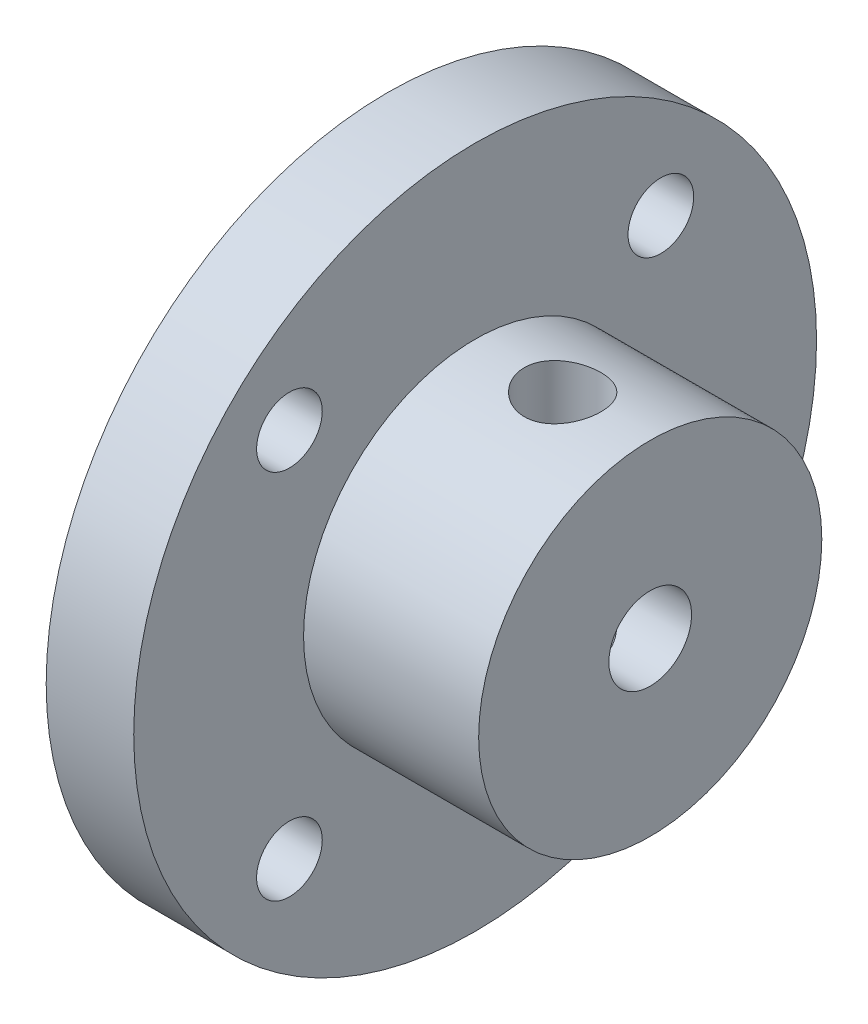
ISO-10303-21;
HEADER;
FILE_DESCRIPTION(('STEP AP214'),'2;1');
FILE_NAME('part.step','',(''),(''),'','','');
FILE_SCHEMA(('AUTOMOTIVE_DESIGN { 1 0 10303 214 1 1 1 1 }'));
ENDSEC;
DATA;
#1=APPLICATION_CONTEXT('core data for automotive mechanical design processes');
#2=APPLICATION_PROTOCOL_DEFINITION('international standard','automotive_design',2000,#1);
#3=PRODUCT_CONTEXT('',#1,'mechanical');
#4=PRODUCT('Part','Part','',(#3));
#5=PRODUCT_RELATED_PRODUCT_CATEGORY('part','',(#4));
#6=PRODUCT_DEFINITION_FORMATION('','',#4);
#7=PRODUCT_DEFINITION_CONTEXT('part definition',#1,'design');
#8=PRODUCT_DEFINITION('design','',#6,#7);
#9=PRODUCT_DEFINITION_SHAPE('','',#8);
#10=(LENGTH_UNIT() NAMED_UNIT(*) SI_UNIT(.MILLI.,.METRE.));
#11=(NAMED_UNIT(*) PLANE_ANGLE_UNIT() SI_UNIT($,.RADIAN.));
#12=(NAMED_UNIT(*) SI_UNIT($,.STERADIAN.) SOLID_ANGLE_UNIT());
#13=UNCERTAINTY_MEASURE_WITH_UNIT(LENGTH_MEASURE(1.E-05),#10,'distance_accuracy_value','');
#14=(GEOMETRIC_REPRESENTATION_CONTEXT(3) GLOBAL_UNCERTAINTY_ASSIGNED_CONTEXT((#13)) GLOBAL_UNIT_ASSIGNED_CONTEXT((#10,
#11,#12)) REPRESENTATION_CONTEXT('',''));
#15=CARTESIAN_POINT('',(0.,0.,0.));
#16=DIRECTION('',(0.,0.,1.));
#17=DIRECTION('',(1.,0.,0.));
#18=AXIS2_PLACEMENT_3D('',#15,#16,#17);
#19=CARTESIAN_POINT('',(33.655,6.25695273145224,0.));
#20=DIRECTION('',(0.,-1.,0.));
#21=DIRECTION('',(0.,0.,-1.));
#22=AXIS2_PLACEMENT_3D('',#19,#20,#21);
#23=CYLINDRICAL_SURFACE('',#22,1.3890625);
#24=CARTESIAN_POINT('',(33.6550000018551,0.566131930488629,-1.38906250011282));
#25=CARTESIAN_POINT('',(33.6169445172271,0.566136363436016,-1.38906135042295));
#26=CARTESIAN_POINT('',(33.578882143224,0.570073234715434,-1.38747438866743));
#27=CARTESIAN_POINT('',(33.5042424862001,0.584696733341379,-1.38137125984007));
#28=CARTESIAN_POINT('',(33.467673787758,0.595417755854354,-1.3768401630535));
#29=CARTESIAN_POINT('',(33.3779129445369,0.628256164088429,-1.36225982533473));
#30=CARTESIAN_POINT('',(33.3261559715453,0.6534020330621,-1.35055961896984));
#31=CARTESIAN_POINT('',(33.2267498564527,0.708660036600426,-1.32241381791735));
#32=CARTESIAN_POINT('',(33.1791175411902,0.738791177298636,-1.30594987449918));
#33=CARTESIAN_POINT('',(33.0898272504429,0.799328389285977,-1.26974272762883));
#34=CARTESIAN_POINT('',(33.0479824606748,0.829611786151766,-1.25025244373348));
#35=CARTESIAN_POINT('',(32.9667509994849,0.890776794559745,-1.20744222947006));
#36=CARTESIAN_POINT('',(32.9273661639242,0.921658830866459,-1.1841194849779));
#37=CARTESIAN_POINT('',(32.8127814790822,1.01377724304036,-1.10839860037947));
#38=CARTESIAN_POINT('',(32.7409454486453,1.07463650939975,-1.0501637134381));
#39=CARTESIAN_POINT('',(32.6250346984733,1.1750598373887,-0.93461893162));
#40=CARTESIAN_POINT('',(32.5785757522292,1.21607083178449,-0.88093575263937));
#41=CARTESIAN_POINT('',(32.4929806941401,1.29244486914924,-0.764466639580026));
#42=CARTESIAN_POINT('',(32.4538317546558,1.32781778955935,-0.701697000846168));
#43=CARTESIAN_POINT('',(32.3919610720956,1.38406863584518,-0.581229147722764));
#44=CARTESIAN_POINT('',(32.3675172598741,1.40643147781827,-0.52511525562623));
#45=CARTESIAN_POINT('',(32.3258147627696,1.44470386715526,-0.408173136065107));
#46=CARTESIAN_POINT('',(32.3085518685538,1.46061719497445,-0.347347695307682));
#47=CARTESIAN_POINT('',(32.282286397532,1.48486442696496,-0.221983584187299));
#48=CARTESIAN_POINT('',(32.2733411512151,1.49314572293324,-0.157422353539631));
#49=CARTESIAN_POINT('',(32.2646726987844,1.50117033703527,-0.0271617916335321));
#50=CARTESIAN_POINT('',(32.2649450487208,1.50091776948048,0.0385369759303967));
#51=CARTESIAN_POINT('',(32.2741246124243,1.49242087146897,0.161397126086323));
#52=CARTESIAN_POINT('',(32.282071569503,1.48506528658008,0.218697772902944));
#53=CARTESIAN_POINT('',(32.3046842064253,1.46418555978732,0.330774166486678));
#54=CARTESIAN_POINT('',(32.3193509055433,1.4506604820742,0.385549528821872));
#55=CARTESIAN_POINT('',(32.3552766932254,1.41765070145482,0.493538521911287));
#56=CARTESIAN_POINT('',(32.3767708622444,1.39795388796705,0.546607626094066));
#57=CARTESIAN_POINT('',(32.4251240438646,1.35388415473823,0.64812554883569));
#58=CARTESIAN_POINT('',(32.4519856818923,1.3295089468536,0.696572089126721));
#59=CARTESIAN_POINT('',(32.5254352084737,1.26334618741132,0.812688908873887));
#60=CARTESIAN_POINT('',(32.5749801323678,1.21913123616765,0.877115357278088));
#61=CARTESIAN_POINT('',(32.6820330158722,1.12538928296294,0.994574693945786));
#62=CARTESIAN_POINT('',(32.7395631791074,1.07584755916379,1.04757472290472));
#63=CARTESIAN_POINT('',(32.862755533221,0.97310190374408,1.14372797191206));
#64=CARTESIAN_POINT('',(32.9285847493599,0.91983745259234,1.1866026547405));
#65=CARTESIAN_POINT('',(33.0325634316817,0.84109300249821,1.24241881793917));
#66=CARTESIAN_POINT('',(33.0680772516681,0.815049059569115,1.25960204433672));
#67=CARTESIAN_POINT('',(33.1411256359287,0.76412026149232,1.29112809224325));
#68=CARTESIAN_POINT('',(33.1786586040067,0.739234518958341,1.30547311665778));
#69=CARTESIAN_POINT('',(33.2536415987214,0.693376581937049,1.33036234023032));
#70=CARTESIAN_POINT('',(33.2909362211174,0.672254841695213,1.34109387455841));
#71=CARTESIAN_POINT('',(33.3681382343715,0.633779428095628,1.35969757594909));
#72=CARTESIAN_POINT('',(33.4080420186164,0.616420690743516,1.36757359549622));
#73=CARTESIAN_POINT('',(33.4822943590198,0.591086061043343,1.37868479636043));
#74=CARTESIAN_POINT('',(33.5161251075231,0.58192054112127,1.38253765716265));
#75=CARTESIAN_POINT('',(33.5849722146235,0.569453283942936,1.38772194270802));
#76=CARTESIAN_POINT('',(33.6199831920039,0.566127851222921,1.38906355799989));
#77=CARTESIAN_POINT('',(33.6930554874779,0.566136363697341,1.38906135018944));
#78=CARTESIAN_POINT('',(33.7311178618527,0.570073235370381,1.38747438836632));
#79=CARTESIAN_POINT('',(33.8057575195479,0.584696734813171,1.38137125925439));
#80=CARTESIAN_POINT('',(33.8423262182885,0.59541775775255,1.37684016224877));
#81=CARTESIAN_POINT('',(33.9320870627309,0.628256167233447,1.36225982388166));
#82=CARTESIAN_POINT('',(33.9838440365631,0.653402037117517,1.35055961702672));
#83=CARTESIAN_POINT('',(34.083250153225,0.708660042431336,1.32241381482273));
#84=CARTESIAN_POINT('',(34.1308824692165,0.738791183993596,1.3059498707433));
#85=CARTESIAN_POINT('',(34.2201727606411,0.799328397135918,1.26974272269951));
#86=CARTESIAN_POINT('',(34.2620175504059,0.829611794268025,1.25025243836101));
#87=CARTESIAN_POINT('',(34.3432490115849,0.890776803120445,1.20744222316865));
#88=CARTESIAN_POINT('',(34.3826338471382,0.921658839605203,1.1841194781908));
#89=CARTESIAN_POINT('',(34.497218531913,1.01377725219562,1.10839859206694));
#90=CARTESIAN_POINT('',(34.5690545622584,1.07463651868664,1.05016370401031));
#91=CARTESIAN_POINT('',(34.6849653112555,1.17505984592962,0.934618920854931));
#92=CARTESIAN_POINT('',(34.731424256568,1.21607083957968,0.880935741841297));
#93=CARTESIAN_POINT('',(34.8170193128417,1.29244487543423,0.764466628912017));
#94=CARTESIAN_POINT('',(34.8561682514416,1.32781779507963,0.701696990340401));
#95=CARTESIAN_POINT('',(34.9180389326472,1.3840686401753,0.581229137401013));
#96=CARTESIAN_POINT('',(34.9424827443489,1.40643148168537,0.525115245251408));
#97=CARTESIAN_POINT('',(34.9841852404068,1.44470387007897,0.408173125694451));
#98=CARTESIAN_POINT('',(35.001448134096,1.46061719741787,0.347347684994239));
#99=CARTESIAN_POINT('',(35.0277136040826,1.48486442845834,0.221983574133389));
#100=CARTESIAN_POINT('',(35.0366588498928,1.49314572395863,0.157422343689642));
#101=CARTESIAN_POINT('',(35.0453273013838,1.50117033719126,0.0271617823191361));
#102=CARTESIAN_POINT('',(35.0450549510139,1.50091776923466,-0.0385369849132359));
#103=CARTESIAN_POINT('',(35.035875386581,1.49242087054839,-0.161397134558102));
#104=CARTESIAN_POINT('',(35.0279284291694,1.48506528535235,-0.218697781201054));
#105=CARTESIAN_POINT('',(35.005315791635,1.4641855579982,-0.330774174381235));
#106=CARTESIAN_POINT('',(34.9906490922379,1.45066048003078,-0.38554953648651));
#107=CARTESIAN_POINT('',(34.954723303967,1.41765069887999,-0.493538529315782));
#108=CARTESIAN_POINT('',(34.9332291346131,1.3979538850926,-0.546607633450231));
#109=CARTESIAN_POINT('',(34.8848759523397,1.35388415128909,-0.648125556044703));
#110=CARTESIAN_POINT('',(34.8580143139937,1.32950894312948,-0.696572096236926));
#111=CARTESIAN_POINT('',(34.7845647864979,1.26334618291036,-0.812688915898741));
#112=CARTESIAN_POINT('',(34.7350198619881,1.21913123115856,-0.877115364258926));
#113=CARTESIAN_POINT('',(34.627966977229,1.12538927698881,-0.994574700722774));
#114=CARTESIAN_POINT('',(34.5704368133542,1.07584755273244,-1.04757472952051));
#115=CARTESIAN_POINT('',(34.4472444578882,0.973101896482502,-1.14372797809964));
#116=CARTESIAN_POINT('',(34.3814152410345,0.919837444959954,-1.18660266065673));
#117=CARTESIAN_POINT('',(34.2774365575354,0.841092994506663,-1.24241882334943));
#118=CARTESIAN_POINT('',(34.2419227371393,0.815049051490737,-1.25960204956193));
#119=CARTESIAN_POINT('',(34.1688743520019,0.764120253355393,-1.29112809705702));
#120=CARTESIAN_POINT('',(34.1313413834572,0.739234510849511,-1.30547312124544));
#121=CARTESIAN_POINT('',(34.0563583884345,0.693376574495653,-1.33036234409477));
#122=CARTESIAN_POINT('',(34.0190637662429,0.672254834841539,-1.34109387797815));
#123=CARTESIAN_POINT('',(33.9418617534332,0.633779422571521,-1.35969757851493));
#124=CARTESIAN_POINT('',(33.9019579694301,0.616420685958523,-1.36757359765474));
#125=CARTESIAN_POINT('',(33.8277056317505,0.591086058452842,-1.37868479744789));
#126=CARTESIAN_POINT('',(33.7938748858276,0.581920539686918,-1.38253765773146));
#127=CARTESIAN_POINT('',(33.7250277841075,0.569453283940591,-1.38772194273621));
#128=CARTESIAN_POINT('',(33.6900168095246,0.56612785150586,-1.38906355800156));
#129=CARTESIAN_POINT('',(33.6550000018551,0.566131930488629,-1.38906250011282));
#130=B_SPLINE_CURVE_WITH_KNOTS('',3,(#24,#25,#26,#27,#28,#29,#30,#31,#32,#33,#34,#35,#36,#37,
#38,#39,#40,#41,#42,#43,#44,#45,#46,#47,#48,#49,#50,#51,#52,#53,#54,#55,#56,#57,#58,#59,#60,#61,
#62,#63,#64,#65,#66,#67,#68,#69,#70,#71,#72,#73,#74,#75,#76,#77,#78,#79,#80,#81,#82,#83,#84,#85,
#86,#87,#88,#89,#90,#91,#92,#93,#94,#95,#96,#97,#98,#99,#100,#101,#102,#103,#104,#105,#106,#107,
#108,#109,#110,#111,#112,#113,#114,#115,#116,#117,#118,#119,#120,#121,#122,#123,#124,#125,#126,
#127,#128,#129),.UNSPECIFIED.,.T.,.F.,(4,2,2,2,2,2,2,2,2,2,2,2,2,2,2,2,2,2,2,2,2,2,2,2,2,2,2,2,
2,2,2,2,2,2,2,2,2,2,2,2,2,2,2,2,2,2,2,2,2,2,2,2,4),(0.,0.113992115299908,0.228566844358918,
0.403728511114996,0.579574048909712,0.744972991640598,0.910493931787427,1.24073848108527,
1.48590457076781,1.73063631323905,1.92536336251059,2.1199761046743,2.31592050793302,
2.5117704446239,2.68591637400935,2.8600887272184,3.04106292438043,3.2221258603288,
3.49815072961655,3.77495908598724,4.05867085653969,4.20039137517086,4.34200146039356,
4.47434162093328,4.60650256598351,4.71182089192411,4.81671090530034,4.93070302182623,
5.04527775216916,5.22043942259775,5.39628496404785,5.56168390768013,5.72720484872445,
6.05744939976325,6.30261548681903,6.54734722668081,6.74207427502693,6.93668701626411,
7.13263141854861,7.32848135427447,7.50262728340702,7.67679963636488,7.8577738340489,
8.03883677051796,8.31486164142205,8.59166999943784,8.87538177171627,9.01710229120903,
9.15871237728041,9.29105253613225,9.42321347940696,9.5285317969457,9.63342180206091),.UNSPECIFIED.);
#131=CARTESIAN_POINT('',(33.6550000018551,0.566131930488629,-1.38906250011282));
#132=VERTEX_POINT('',#131);
#133=EDGE_CURVE('E49',#132,#132,#130,.T.);
#134=ORIENTED_EDGE('',*,*,#133,.F.);
#135=EDGE_LOOP('',(#134));
#136=FACE_BOUND('',#135,.T.);
#137=CARTESIAN_POINT('',(33.6549999999501,6.06598997452961,-1.3890625));
#138=CARTESIAN_POINT('',(33.578110063995,6.0659921792288,-1.38905868039441));
#139=CARTESIAN_POINT('',(33.501126664296,6.0674693754223,-1.38265024310163));
#140=CARTESIAN_POINT('',(33.3492874175762,6.07321250864838,-1.35719635142212));
#141=CARTESIAN_POINT('',(33.2744360048206,6.07748386986387,-1.33812631658384));
#142=CARTESIAN_POINT('',(33.1291754650171,6.08830741727272,-1.28798075912738));
#143=CARTESIAN_POINT('',(33.0587594182229,6.09485594118661,-1.25692450475727));
#144=CARTESIAN_POINT('',(32.9241568514187,6.10949118255512,-1.18373673496127));
#145=CARTESIAN_POINT('',(32.8599685178455,6.11757745016298,-1.14160845713721));
#146=CARTESIAN_POINT('',(32.7384811025654,6.13453833087701,-1.04667289375866));
#147=CARTESIAN_POINT('',(32.681307948368,6.14342344395721,-0.993706294145083));
#148=CARTESIAN_POINT('',(32.5765764585476,6.16088945409957,-0.878938922781664));
#149=CARTESIAN_POINT('',(32.529019408616,6.1694703103557,-0.817136971611682));
#150=CARTESIAN_POINT('',(32.4443777730578,6.1854740395568,-0.68561599519218));
#151=CARTESIAN_POINT('',(32.4074135722691,6.19288320264947,-0.615817682977105));
#152=CARTESIAN_POINT('',(32.3457867575017,6.20559097930638,-0.470807350062398));
#153=CARTESIAN_POINT('',(32.3211226042539,6.21088985694209,-0.395596008116139));
#154=CARTESIAN_POINT('',(32.2851897831664,6.21870644290242,-0.243194618416293));
#155=CARTESIAN_POINT('',(32.2737094037637,6.22126805947618,-0.166056777678495));
#156=CARTESIAN_POINT('',(32.2638077370767,6.22347374938157,-0.0109102012615165));
#157=CARTESIAN_POINT('',(32.2653849151785,6.22311816556271,0.0670984310001087));
#158=CARTESIAN_POINT('',(32.2813966176642,6.2195629629392,0.220310792951995));
#159=CARTESIAN_POINT('',(32.2956028005613,6.2164138552018,0.295539730973925));
#160=CARTESIAN_POINT('',(32.3361051355874,6.20768312866383,0.442518624739475));
#161=CARTESIAN_POINT('',(32.3624019342287,6.20210137978531,0.514268394217335));
#162=CARTESIAN_POINT('',(32.4265395479197,6.18905165544188,0.652883185803265));
#163=CARTESIAN_POINT('',(32.4644665344383,6.18156967419367,0.719706963237083));
#164=CARTESIAN_POINT('',(32.5507207152961,6.16553942253473,0.846119641800551));
#165=CARTESIAN_POINT('',(32.5990486497503,6.15699107626134,0.905708027598911));
#166=CARTESIAN_POINT('',(32.705964300368,6.13954947545599,1.01731254726051));
#167=CARTESIAN_POINT('',(32.7647501273316,6.13065275649804,1.06913850006591));
#168=CARTESIAN_POINT('',(32.8902991061468,6.11368469114758,1.16225489323628));
#169=CARTESIAN_POINT('',(32.9570657757099,6.1056137116462,1.20354066248284));
#170=CARTESIAN_POINT('',(33.0970165860465,6.09120007477828,1.27449273569667));
#171=CARTESIAN_POINT('',(33.1702251148813,6.08486439479396,1.30411233475695));
#172=CARTESIAN_POINT('',(33.3206640809537,6.07473592244712,1.35051307825111));
#173=CARTESIAN_POINT('',(33.3978856758823,6.0709377752841,1.36732126845218));
#174=CARTESIAN_POINT('',(33.5055982696661,6.06775615915066,1.38133049128532));
#175=CARTESIAN_POINT('',(33.5353968853382,6.06709548584805,1.38422736042632));
#176=CARTESIAN_POINT('',(33.5951256086556,6.06621196369583,1.3880941109155));
#177=CARTESIAN_POINT('',(33.6250557166247,6.06598911592473,1.38906398751691));
#178=CARTESIAN_POINT('',(33.7318899358405,6.06599217922672,1.38905868040349));
#179=CARTESIAN_POINT('',(33.8088733355397,6.06746937541812,1.38265024311988));
#180=CARTESIAN_POINT('',(33.9607125822618,6.07321250864021,1.35719635145861));
#181=CARTESIAN_POINT('',(34.0355639950193,6.07748386985381,1.33812631662936));
#182=CARTESIAN_POINT('',(34.1808245348282,6.08830741725932,1.28798075919055));
#183=CARTESIAN_POINT('',(34.2512405816258,6.09485594117176,1.25692450482905));
#184=CARTESIAN_POINT('',(34.3858431484381,6.10949118253794,1.18373673504967));
#185=CARTESIAN_POINT('',(34.450031482016,6.11757745014493,1.14160845723362));
#186=CARTESIAN_POINT('',(34.5715188973068,6.13453833085786,1.04667289387051));
#187=CARTESIAN_POINT('',(34.6286920515102,6.14342344393786,0.993706294264349));
#188=CARTESIAN_POINT('',(34.7334235413439,6.16088945408051,0.878938922914794));
#189=CARTESIAN_POINT('',(34.7809805912827,6.16947031033715,0.817136971751253));
#190=CARTESIAN_POINT('',(34.8656222268568,6.18547403954004,0.685615995342884));
#191=CARTESIAN_POINT('',(34.9025864276542,6.19288320263398,0.615817683132416));
#192=CARTESIAN_POINT('',(34.9642132424397,6.20559097929397,0.470807350225392));
#193=CARTESIAN_POINT('',(34.9888773956969,6.21088985693149,0.39559600828221));
#194=CARTESIAN_POINT('',(35.0248102168034,6.21870644289575,0.243194618586249));
#195=CARTESIAN_POINT('',(35.0362905962158,6.22126805947162,0.166056777849264));
#196=CARTESIAN_POINT('',(35.046192262922,6.22347374938127,0.0109102014322084));
#197=CARTESIAN_POINT('',(35.0446150848297,6.22311816556456,-0.0670984308303065));
#198=CARTESIAN_POINT('',(35.0286033823626,6.21956296294512,-0.220310792785103));
#199=CARTESIAN_POINT('',(35.0143971994746,6.21641385520968,-0.295539730809033));
#200=CARTESIAN_POINT('',(34.9738948644661,6.20768312867523,-0.44251862458005));
#201=CARTESIAN_POINT('',(34.9475980658334,6.20210137979828,-0.514268394061376));
#202=CARTESIAN_POINT('',(34.8834604521591,6.18905165545756,-0.652883185654902));
#203=CARTESIAN_POINT('',(34.8455334656488,6.18156967421051,-0.719706963092913));
#204=CARTESIAN_POINT('',(34.759279284807,6.16553942255323,-0.846119641666077));
#205=CARTESIAN_POINT('',(34.7109513503603,6.15699107628037,-0.905708027469942));
#206=CARTESIAN_POINT('',(34.6040356997569,6.13954947547536,-1.01731254714392));
#207=CARTESIAN_POINT('',(34.5452498728001,6.13065275651723,-1.06913849995622));
#208=CARTESIAN_POINT('',(34.4197008939973,6.11368469116567,-1.16225489314143));
#209=CARTESIAN_POINT('',(34.3529342244399,6.10561371166338,-1.20354066239596));
#210=CARTESIAN_POINT('',(34.2129834141125,6.0912000747929,-1.27449273562705));
#211=CARTESIAN_POINT('',(34.1397748852813,6.08486439480695,-1.30411233469652));
#212=CARTESIAN_POINT('',(33.9893359192142,6.07473592245639,-1.35051307820956));
#213=CARTESIAN_POINT('',(33.9121143242875,6.0709377752913,-1.36732126842028));
#214=CARTESIAN_POINT('',(33.8044017304494,6.06775615915324,-1.38133049127404));
#215=CARTESIAN_POINT('',(33.7746031147217,6.06709548584895,-1.38422736042235));
#216=CARTESIAN_POINT('',(33.7148743912926,6.06621196369504,-1.38809411091893));
#217=CARTESIAN_POINT('',(33.6849442832675,6.06598911592391,-1.38906398752045));
#218=CARTESIAN_POINT('',(33.6549999999501,6.06598997452961,-1.3890625));
#219=B_SPLINE_CURVE_WITH_KNOTS('',3,(#137,#138,#139,#140,#141,#142,#143,#144,#145,#146,#147,
#148,#149,#150,#151,#152,#153,#154,#155,#156,#157,#158,#159,#160,#161,#162,#163,#164,#165,#166,
#167,#168,#169,#170,#171,#172,#173,#174,#175,#176,#177,#178,#179,#180,#181,#182,#183,#184,#185,
#186,#187,#188,#189,#190,#191,#192,#193,#194,#195,#196,#197,#198,#199,#200,#201,#202,#203,#204,
#205,#206,#207,#208,#209,#210,#211,#212,#213,#214,#215,#216,#217,#218),.UNSPECIFIED.,.T.,.F.,(4,
2,2,2,2,2,2,2,2,2,2,2,2,2,2,2,2,2,2,2,2,2,2,2,2,2,2,2,2,2,2,2,2,2,2,2,2,2,2,2,4),(0.,
0.230555019327038,0.46155893791329,0.692193046376303,0.922759789354967,1.15699669848525,
1.39126490485737,1.62809853414697,1.86490251784113,2.09784813553934,2.330766376254,
2.55955705179472,2.78835996270813,3.01890086925575,3.24945818615775,3.4849686837663,
3.72058337265319,3.95713197133114,4.19317980584416,4.28296773080728,4.37275587694505,
4.6033108962703,4.83431481485524,5.06494892331681,5.2955156662939,5.52975257542223,
5.76402078179245,6.0008544110824,6.23765839477693,6.47060401247718,6.70352225319386,
6.93231292873517,7.16111583964912,7.39165674619506,7.62221406309542,7.85772456070254,
8.0933392495879,8.32988784826667,8.56593568278101,8.655723607912,8.74551175421765),.UNSPECIFIED.);
#220=CARTESIAN_POINT('',(33.6549999999501,6.06598997452961,-1.3890625));
#221=VERTEX_POINT('',#220);
#222=EDGE_CURVE('E57',#221,#221,#219,.T.);
#223=ORIENTED_EDGE('',*,*,#222,.T.);
#224=EDGE_LOOP('',(#223));
#225=FACE_BOUND('',#224,.T.);
#226=ADVANCED_FACE('F15',(#136,#225),#23,.F.);
#227=CARTESIAN_POINT('',(27.305,0.,0.));
#228=DIRECTION('',(1.,0.,0.));
#229=DIRECTION('',(0.,0.,-1.));
#230=AXIS2_PLACEMENT_3D('',#227,#228,#229);
#231=CYLINDRICAL_SURFACE('',#230,12.3825);
#232=CARTESIAN_POINT('',(27.305,0.,0.));
#233=DIRECTION('',(1.,0.,0.));
#234=DIRECTION('',(0.,0.,-1.));
#235=AXIS2_PLACEMENT_3D('',#232,#233,#234);
#236=CIRCLE('',#235,12.3825);
#237=CARTESIAN_POINT('',(27.305,0.,-12.3825));
#238=VERTEX_POINT('',#237);
#239=EDGE_CURVE('E56',#238,#238,#236,.F.);
#240=ORIENTED_EDGE('',*,*,#239,.F.);
#241=EDGE_LOOP('',(#240));
#242=FACE_BOUND('',#241,.T.);
#243=CARTESIAN_POINT('',(30.48,0.,0.));
#244=DIRECTION('',(1.,0.,0.));
#245=DIRECTION('',(0.,0.,-1.));
#246=AXIS2_PLACEMENT_3D('',#243,#244,#245);
#247=CIRCLE('',#246,12.3825);
#248=CARTESIAN_POINT('',(30.48,0.,-12.3825));
#249=VERTEX_POINT('',#248);
#250=EDGE_CURVE('E19',#249,#249,#247,.F.);
#251=ORIENTED_EDGE('',*,*,#250,.T.);
#252=EDGE_LOOP('',(#251));
#253=FACE_BOUND('',#252,.T.);
#254=ADVANCED_FACE('F66',(#242,#253),#231,.T.);
#255=CARTESIAN_POINT('',(27.305,-6.7351920922,-6.7351920922));
#256=DIRECTION('',(1.,0.,0.));
#257=DIRECTION('',(0.,0.,-1.));
#258=AXIS2_PLACEMENT_3D('',#255,#256,#257);
#259=CYLINDRICAL_SURFACE('',#258,1.190625);
#260=CARTESIAN_POINT('',(27.305,-6.7351920922,-6.7351920922));
#261=DIRECTION('',(1.,0.,0.));
#262=DIRECTION('',(0.,0.,-1.));
#263=AXIS2_PLACEMENT_3D('',#260,#261,#262);
#264=CIRCLE('',#263,1.190625);
#265=CARTESIAN_POINT('',(27.305,-6.7351920922,-7.9258170922));
#266=VERTEX_POINT('',#265);
#267=EDGE_CURVE('E125',#266,#266,#264,.T.);
#268=ORIENTED_EDGE('',*,*,#267,.F.);
#269=EDGE_LOOP('',(#268));
#270=FACE_BOUND('',#269,.T.);
#271=CARTESIAN_POINT('',(30.48,-6.7351920922,-6.7351920922));
#272=DIRECTION('',(1.,0.,0.));
#273=DIRECTION('',(0.,0.,-1.));
#274=AXIS2_PLACEMENT_3D('',#271,#272,#273);
#275=CIRCLE('',#274,1.190625);
#276=CARTESIAN_POINT('',(30.48,-6.7351920922,-7.9258170922));
#277=VERTEX_POINT('',#276);
#278=EDGE_CURVE('E106',#277,#277,#275,.T.);
#279=ORIENTED_EDGE('',*,*,#278,.T.);
#280=EDGE_LOOP('',(#279));
#281=FACE_BOUND('',#280,.T.);
#282=ADVANCED_FACE('F115',(#270,#281),#259,.F.);
#283=CARTESIAN_POINT('',(27.305,-6.7351920922,6.7351920922));
#284=DIRECTION('',(1.,0.,0.));
#285=DIRECTION('',(0.,0.,-1.));
#286=AXIS2_PLACEMENT_3D('',#283,#284,#285);
#287=CYLINDRICAL_SURFACE('',#286,1.190625);
#288=CARTESIAN_POINT('',(27.305,-6.7351920922,6.7351920922));
#289=DIRECTION('',(1.,0.,0.));
#290=DIRECTION('',(0.,0.,-1.));
#291=AXIS2_PLACEMENT_3D('',#288,#289,#290);
#292=CIRCLE('',#291,1.190625);
#293=CARTESIAN_POINT('',(27.305,-6.7351920922,5.5445670922));
#294=VERTEX_POINT('',#293);
#295=EDGE_CURVE('E127',#294,#294,#292,.T.);
#296=ORIENTED_EDGE('',*,*,#295,.F.);
#297=EDGE_LOOP('',(#296));
#298=FACE_BOUND('',#297,.T.);
#299=CARTESIAN_POINT('',(30.48,-6.7351920922,6.7351920922));
#300=DIRECTION('',(1.,0.,0.));
#301=DIRECTION('',(0.,0.,-1.));
#302=AXIS2_PLACEMENT_3D('',#299,#300,#301);
#303=CIRCLE('',#302,1.190625);
#304=CARTESIAN_POINT('',(30.48,-6.7351920922,5.5445670922));
#305=VERTEX_POINT('',#304);
#306=EDGE_CURVE('E102',#305,#305,#303,.T.);
#307=ORIENTED_EDGE('',*,*,#306,.T.);
#308=EDGE_LOOP('',(#307));
#309=FACE_BOUND('',#308,.T.);
#310=ADVANCED_FACE('F120',(#298,#309),#287,.F.);
#311=CARTESIAN_POINT('',(27.305,6.7351920922,6.7351920922));
#312=DIRECTION('',(1.,0.,0.));
#313=DIRECTION('',(0.,0.,-1.));
#314=AXIS2_PLACEMENT_3D('',#311,#312,#313);
#315=CYLINDRICAL_SURFACE('',#314,1.190625);
#316=CARTESIAN_POINT('',(27.305,6.7351920922,6.7351920922));
#317=DIRECTION('',(1.,0.,0.));
#318=DIRECTION('',(0.,0.,-1.));
#319=AXIS2_PLACEMENT_3D('',#316,#317,#318);
#320=CIRCLE('',#319,1.190625);
#321=CARTESIAN_POINT('',(27.305,6.7351920922,5.5445670922));
#322=VERTEX_POINT('',#321);
#323=EDGE_CURVE('E131',#322,#322,#320,.T.);
#324=ORIENTED_EDGE('',*,*,#323,.F.);
#325=EDGE_LOOP('',(#324));
#326=FACE_BOUND('',#325,.T.);
#327=CARTESIAN_POINT('',(30.48,6.7351920922,6.7351920922));
#328=DIRECTION('',(1.,0.,0.));
#329=DIRECTION('',(0.,0.,-1.));
#330=AXIS2_PLACEMENT_3D('',#327,#328,#329);
#331=CIRCLE('',#330,1.190625);
#332=CARTESIAN_POINT('',(30.48,6.7351920922,5.5445670922));
#333=VERTEX_POINT('',#332);
#334=EDGE_CURVE('E98',#333,#333,#331,.T.);
#335=ORIENTED_EDGE('',*,*,#334,.T.);
#336=EDGE_LOOP('',(#335));
#337=FACE_BOUND('',#336,.T.);
#338=ADVANCED_FACE('F160',(#326,#337),#315,.F.);
#339=CARTESIAN_POINT('',(27.305,6.7351920922,-6.7351920922));
#340=DIRECTION('',(1.,0.,0.));
#341=DIRECTION('',(0.,0.,-1.));
#342=AXIS2_PLACEMENT_3D('',#339,#340,#341);
#343=CYLINDRICAL_SURFACE('',#342,1.190625);
#344=CARTESIAN_POINT('',(27.305,6.7351920922,-6.7351920922));
#345=DIRECTION('',(1.,0.,0.));
#346=DIRECTION('',(0.,0.,-1.));
#347=AXIS2_PLACEMENT_3D('',#344,#345,#346);
#348=CIRCLE('',#347,1.190625);
#349=CARTESIAN_POINT('',(27.305,6.7351920922,-7.9258170922));
#350=VERTEX_POINT('',#349);
#351=EDGE_CURVE('E136',#350,#350,#348,.T.);
#352=ORIENTED_EDGE('',*,*,#351,.F.);
#353=EDGE_LOOP('',(#352));
#354=FACE_BOUND('',#353,.T.);
#355=CARTESIAN_POINT('',(30.48,6.7351920922,-6.7351920922));
#356=DIRECTION('',(1.,0.,0.));
#357=DIRECTION('',(0.,0.,-1.));
#358=AXIS2_PLACEMENT_3D('',#355,#356,#357);
#359=CIRCLE('',#358,1.190625);
#360=CARTESIAN_POINT('',(30.48,6.7351920922,-7.9258170922));
#361=VERTEX_POINT('',#360);
#362=EDGE_CURVE('E96',#361,#361,#359,.T.);
#363=ORIENTED_EDGE('',*,*,#362,.T.);
#364=EDGE_LOOP('',(#363));
#365=FACE_BOUND('',#364,.T.);
#366=ADVANCED_FACE('F73',(#354,#365),#343,.F.);
#367=CARTESIAN_POINT('',(30.48,12.53109,12.53109));
#368=DIRECTION('',(-1.,0.,0.));
#369=DIRECTION('',(0.,0.,-1.));
#370=AXIS2_PLACEMENT_3D('',#367,#368,#369);
#371=PLANE('',#370);
#372=CARTESIAN_POINT('',(30.48,0.,0.));
#373=DIRECTION('',(-1.,0.,0.));
#374=DIRECTION('',(0.,0.,1.));
#375=AXIS2_PLACEMENT_3D('',#372,#373,#374);
#376=CIRCLE('',#375,6.223);
#377=CARTESIAN_POINT('',(30.48,0.,6.223));
#378=VERTEX_POINT('',#377);
#379=EDGE_CURVE('E139',#378,#378,#376,.T.);
#380=ORIENTED_EDGE('',*,*,#379,.T.);
#381=EDGE_LOOP('',(#380));
#382=FACE_BOUND('',#381,.T.);
#383=ORIENTED_EDGE('',*,*,#362,.F.);
#384=EDGE_LOOP('',(#383));
#385=FACE_BOUND('',#384,.T.);
#386=ORIENTED_EDGE('',*,*,#334,.F.);
#387=EDGE_LOOP('',(#386));
#388=FACE_BOUND('',#387,.T.);
#389=ORIENTED_EDGE('',*,*,#306,.F.);
#390=EDGE_LOOP('',(#389));
#391=FACE_BOUND('',#390,.T.);
#392=ORIENTED_EDGE('',*,*,#278,.F.);
#393=EDGE_LOOP('',(#392));
#394=FACE_BOUND('',#393,.T.);
#395=ORIENTED_EDGE('',*,*,#250,.F.);
#396=EDGE_LOOP('',(#395));
#397=FACE_BOUND('',#396,.T.);
#398=ADVANCED_FACE('F69',(#382,#385,#388,#391,#394,#397),#371,.F.);
#399=CARTESIAN_POINT('',(36.83,6.297676,-6.297676));
#400=DIRECTION('',(1.,0.,0.));
#401=DIRECTION('',(0.,0.,1.));
#402=AXIS2_PLACEMENT_3D('',#399,#400,#401);
#403=PLANE('',#402);
#404=CARTESIAN_POINT('',(36.83,0.,0.));
#405=DIRECTION('',(-1.,0.,0.));
#406=DIRECTION('',(0.,0.,1.));
#407=AXIS2_PLACEMENT_3D('',#404,#405,#406);
#408=CIRCLE('',#407,1.4999999972);
#409=CARTESIAN_POINT('',(36.83,0.,1.4999999972));
#410=VERTEX_POINT('',#409);
#411=EDGE_CURVE('E145',#410,#410,#408,.F.);
#412=ORIENTED_EDGE('',*,*,#411,.F.);
#413=EDGE_LOOP('',(#412));
#414=FACE_BOUND('',#413,.T.);
#415=CARTESIAN_POINT('',(36.83,0.,0.));
#416=DIRECTION('',(-1.,0.,0.));
#417=DIRECTION('',(0.,0.,1.));
#418=AXIS2_PLACEMENT_3D('',#415,#416,#417);
#419=CIRCLE('',#418,6.223);
#420=CARTESIAN_POINT('',(36.83,0.,6.223));
#421=VERTEX_POINT('',#420);
#422=EDGE_CURVE('E142',#421,#421,#419,.F.);
#423=ORIENTED_EDGE('',*,*,#422,.T.);
#424=EDGE_LOOP('',(#423));
#425=FACE_BOUND('',#424,.T.);
#426=ADVANCED_FACE('F72',(#414,#425),#403,.T.);
#427=CARTESIAN_POINT('',(27.305,12.53109,12.53109));
#428=DIRECTION('',(-1.,0.,0.));
#429=DIRECTION('',(0.,0.,-1.));
#430=AXIS2_PLACEMENT_3D('',#427,#428,#429);
#431=PLANE('',#430);
#432=CARTESIAN_POINT('',(27.305,0.,0.));
#433=DIRECTION('',(-1.,0.,0.));
#434=DIRECTION('',(0.,0.,1.));
#435=AXIS2_PLACEMENT_3D('',#432,#433,#434);
#436=CIRCLE('',#435,1.4999999972);
#437=CARTESIAN_POINT('',(27.305,0.,1.4999999972));
#438=VERTEX_POINT('',#437);
#439=EDGE_CURVE('E28',#438,#438,#436,.T.);
#440=ORIENTED_EDGE('',*,*,#439,.F.);
#441=EDGE_LOOP('',(#440));
#442=FACE_BOUND('',#441,.T.);
#443=ORIENTED_EDGE('',*,*,#351,.T.);
#444=EDGE_LOOP('',(#443));
#445=FACE_BOUND('',#444,.T.);
#446=ORIENTED_EDGE('',*,*,#323,.T.);
#447=EDGE_LOOP('',(#446));
#448=FACE_BOUND('',#447,.T.);
#449=ORIENTED_EDGE('',*,*,#295,.T.);
#450=EDGE_LOOP('',(#449));
#451=FACE_BOUND('',#450,.T.);
#452=ORIENTED_EDGE('',*,*,#267,.T.);
#453=EDGE_LOOP('',(#452));
#454=FACE_BOUND('',#453,.T.);
#455=ORIENTED_EDGE('',*,*,#239,.T.);
#456=EDGE_LOOP('',(#455));
#457=FACE_BOUND('',#456,.T.);
#458=ADVANCED_FACE('F17',(#442,#445,#448,#451,#454,#457),#431,.T.);
#459=CARTESIAN_POINT('',(36.83,0.,0.));
#460=DIRECTION('',(-1.,0.,0.));
#461=DIRECTION('',(0.,0.,1.));
#462=AXIS2_PLACEMENT_3D('',#459,#460,#461);
#463=CYLINDRICAL_SURFACE('',#462,6.223);
#464=ORIENTED_EDGE('',*,*,#379,.F.);
#465=EDGE_LOOP('',(#464));
#466=FACE_BOUND('',#465,.T.);
#467=ORIENTED_EDGE('',*,*,#422,.F.);
#468=EDGE_LOOP('',(#467));
#469=FACE_BOUND('',#468,.T.);
#470=CARTESIAN_POINT('',(33.6549999998503,-6.06598997353369,1.38906249875024));
#471=CARTESIAN_POINT('',(33.5781100638403,-6.0659921775805,1.38905867831885));
#472=CARTESIAN_POINT('',(33.5011266640868,-6.06746937498508,1.38265024252403));
#473=CARTESIAN_POINT('',(33.3492874173859,-6.07321250910159,1.35719635193378));
#474=CARTESIAN_POINT('',(33.2744360047015,-6.07748386999055,1.33812631669612));
#475=CARTESIAN_POINT('',(33.1291754649983,-6.08830741715651,1.28798075896776));
#476=CARTESIAN_POINT('',(33.0587594182344,-6.09485594115411,1.2569245047204));
#477=CARTESIAN_POINT('',(32.9241568514373,-6.10949118258433,1.18373673501453));
#478=CARTESIAN_POINT('',(32.8599685178454,-6.11757745017138,1.14160845714951));
#479=CARTESIAN_POINT('',(32.7384811025386,-6.13453833087224,1.04667289372506));
#480=CARTESIAN_POINT('',(32.6813079483324,-6.14342344396049,0.9937062941082));
#481=CARTESIAN_POINT('',(32.5765764585167,-6.16088945410739,0.878938922745638));
#482=CARTESIAN_POINT('',(32.5290194085954,-6.16947031036013,0.817136971582893));
#483=CARTESIAN_POINT('',(32.4443777730495,-6.18547403955782,0.68561599517611));
#484=CARTESIAN_POINT('',(32.407413572264,-6.19288320265035,0.615817682965773));
#485=CARTESIAN_POINT('',(32.3457867574973,-6.20559097930748,0.470807350051181));
#486=CARTESIAN_POINT('',(32.3211226042486,-6.21088985694326,0.395596008099599));
#487=CARTESIAN_POINT('',(32.2851897831622,-6.21870644290332,0.243194618392627));
#488=CARTESIAN_POINT('',(32.2737094037606,-6.22126805947686,0.166056777653166));
#489=CARTESIAN_POINT('',(32.2638077370766,-6.2234737493816,0.0109102012361943));
#490=CARTESIAN_POINT('',(32.2653849151798,-6.22311816556243,-0.0670984310237239));
#491=CARTESIAN_POINT('',(32.2813966176676,-6.21956296293843,-0.220310792973239));
#492=CARTESIAN_POINT('',(32.2956028005658,-6.21641385520082,-0.295539730994486));
#493=CARTESIAN_POINT('',(32.3361051355941,-6.20768312866241,-0.442518624759364));
#494=CARTESIAN_POINT('',(32.3624019342366,-6.20210137978366,-0.514268394237195));
#495=CARTESIAN_POINT('',(32.42653954793,-6.18905165543983,-0.652883185822634));
#496=CARTESIAN_POINT('',(32.4644665344497,-6.18156967419146,-0.719706963256005));
#497=CARTESIAN_POINT('',(32.5507207153096,-6.1655394225323,-0.846119641818191));
#498=CARTESIAN_POINT('',(32.5990486497647,-6.15699107625886,-0.905708027615741));
#499=CARTESIAN_POINT('',(32.7059643003842,-6.13954947545348,-1.0173125472756));
#500=CARTESIAN_POINT('',(32.7647501273486,-6.13065275649556,-1.06913850008008));
#501=CARTESIAN_POINT('',(32.8902991061654,-6.11368469114524,-1.16225489324853));
#502=CARTESIAN_POINT('',(32.9570657757293,-6.10561371164397,-1.20354066249409));
#503=CARTESIAN_POINT('',(33.0970165860673,-6.09120007477637,-1.27449273570578));
#504=CARTESIAN_POINT('',(33.1702251149027,-6.08486439479225,-1.30411233476491));
#505=CARTESIAN_POINT('',(33.3206640809759,-6.07473592244589,-1.35051307825659));
#506=CARTESIAN_POINT('',(33.3978856759046,-6.07093777528315,-1.36732126845636));
#507=CARTESIAN_POINT('',(33.5055982695808,-6.06775615915329,-1.38133049127374));
#508=CARTESIAN_POINT('',(33.5353968851446,-6.0670954858524,-1.38422736040725));
#509=CARTESIAN_POINT('',(33.5951256082449,-6.06621196370042,-1.38809411089544));
#510=CARTESIAN_POINT('',(33.6250557161051,-6.06598911592783,-1.38906398750337));
#511=CARTESIAN_POINT('',(33.7318899352306,-6.06599217921876,-1.38905868043825));
#512=CARTESIAN_POINT('',(33.8088733349512,-6.06746937540289,-1.3826502431864));
#513=CARTESIAN_POINT('',(33.9607125817207,-6.07321250861267,-1.35719635158158));
#514=CARTESIAN_POINT('',(34.0355639945042,-6.07748386982123,-1.33812631677694));
#515=CARTESIAN_POINT('',(34.1808245343403,-6.08830741721718,-1.28798075938914));
#516=CARTESIAN_POINT('',(34.2512405811408,-6.09485594112424,-1.25692450505851));
#517=CARTESIAN_POINT('',(34.3858431479646,-6.10949118248123,-1.18373673534138));
#518=CARTESIAN_POINT('',(34.4500314815511,-6.11757745008439,-1.14160845755671));
#519=CARTESIAN_POINT('',(34.5715188968718,-6.13453833079269,-1.04667289425124));
#520=CARTESIAN_POINT('',(34.6286920510958,-6.14342344387198,-0.993706294670234));
#521=CARTESIAN_POINT('',(34.7334235409746,-6.16088945401568,-0.878938923367685));
#522=CARTESIAN_POINT('',(34.780980590938,-6.16947031027406,-0.817136972225998));
#523=CARTESIAN_POINT('',(34.8656222265665,-6.18547403948302,-0.685615995855603));
#524=CARTESIAN_POINT('',(34.9025864273933,-6.19288320258127,-0.615817683660999));
#525=CARTESIAN_POINT('',(34.9642132422402,-6.20559097925174,-0.470807350780154));
#526=CARTESIAN_POINT('',(34.9888773955293,-6.21088985689541,-0.395596008847257));
#527=CARTESIAN_POINT('',(35.0248102167011,-6.21870644287312,-0.243194619163565));
#528=CARTESIAN_POINT('',(35.0362905961464,-6.22126805945617,-0.166056778428556));
#529=CARTESIAN_POINT('',(35.0461922629175,-6.22347374938024,-0.0109102020112198));
#530=CARTESIAN_POINT('',(35.0446150848577,-6.22311816557083,0.0670984302535331));
#531=CARTESIAN_POINT('',(35.028603382454,-6.21956296296534,0.220310792214953));
#532=CARTESIAN_POINT('',(35.0143971995975,-6.21641385523668,0.295539730243233));
#533=CARTESIAN_POINT('',(34.9738948646498,-6.20768312871433,0.442518624033018));
#534=CARTESIAN_POINT('',(34.9475980660455,-6.20210137984256,0.514268393528535));
#535=CARTESIAN_POINT('',(34.8834604524241,-6.18905165551036,0.652883185157144));
#536=CARTESIAN_POINT('',(34.8455334659378,-6.18156967426657,0.71970696261591));
#537=CARTESIAN_POINT('',(34.7592792851479,-6.16553942261423,0.846119641219987));
#538=CARTESIAN_POINT('',(34.7109513507312,-6.15699107634323,0.905708027035413));
#539=CARTESIAN_POINT('',(34.604035700195,-6.13954947554443,1.01731254673498));
#540=CARTESIAN_POINT('',(34.5452498732767,-6.13065275659069,1.06913849956281));
#541=CARTESIAN_POINT('',(34.4197008945197,-6.11368469122723,1.16225489279391));
#542=CARTESIAN_POINT('',(34.3529342249659,-6.10561371170906,1.20354066207368));
#543=CARTESIAN_POINT('',(34.2129834146264,-6.09120007485435,1.27449273542239));
#544=CARTESIAN_POINT('',(34.1397748857784,-6.08486439490056,1.30411233458229));
#545=CARTESIAN_POINT('',(33.9893359197235,-6.07473592243069,1.35051307801341));
#546=CARTESIAN_POINT('',(33.912114324829,-6.07093777511256,1.36732126806215));
#547=CARTESIAN_POINT('',(33.8044017309329,-6.06775615924157,1.38133049132065));
#548=CARTESIAN_POINT('',(33.7746031151085,-6.0670954860606,1.38422736064809));
#549=CARTESIAN_POINT('',(33.7148743914528,-6.06621196349148,1.38809411065778));
#550=CARTESIAN_POINT('',(33.6849442832977,-6.06598911518205,1.38906398659229));
#551=CARTESIAN_POINT('',(33.6549999998503,-6.06598997353369,1.38906249875024));
#552=B_SPLINE_CURVE_WITH_KNOTS('',3,(#470,#471,#472,#473,#474,#475,#476,#477,#478,#479,#480,
#481,#482,#483,#484,#485,#486,#487,#488,#489,#490,#491,#492,#493,#494,#495,#496,#497,#498,#499,
#500,#501,#502,#503,#504,#505,#506,#507,#508,#509,#510,#511,#512,#513,#514,#515,#516,#517,#518,
#519,#520,#521,#522,#523,#524,#525,#526,#527,#528,#529,#530,#531,#532,#533,#534,#535,#536,#537,
#538,#539,#540,#541,#542,#543,#544,#545,#546,#547,#548,#549,#550,#551),.UNSPECIFIED.,.T.,.F.,(4,
2,2,2,2,2,2,2,2,2,2,2,2,2,2,2,2,2,2,2,2,2,2,2,2,2,2,2,2,2,2,2,2,2,2,2,2,2,2,2,4),(0.,
0.230555019384353,0.461558937789388,0.692193046145816,0.92275978919216,1.15699669836411,
1.39126490469553,1.62809853396981,1.86490251767921,2.09784813538188,2.33076637609155,
2.55955705163091,2.78835996254554,3.01890086909371,3.24945818599558,3.48496868360413,
3.7205833724914,3.95713197116974,4.1931798056821,4.28296773032021,4.37275587613303,
4.60331089551278,4.83431481415328,5.06494892258451,5.29551566553088,5.52975257465302,
5.764020781017,6.00085441030751,6.23765839400385,6.47060401171334,6.70352225243461,
6.93231292797032,7.16111583889371,7.39165674545636,7.62221406232871,7.857724559874,
8.09333924881113,8.32988784758495,8.56593568201155,8.65572360744615,8.74551175409982),.UNSPECIFIED.);
#553=CARTESIAN_POINT('',(33.6549999998503,-6.06598997353369,1.38906249875024));
#554=VERTEX_POINT('',#553);
#555=EDGE_CURVE('E23',#554,#554,#552,.T.);
#556=ORIENTED_EDGE('',*,*,#555,.F.);
#557=EDGE_LOOP('',(#556));
#558=FACE_BOUND('',#557,.T.);
#559=ORIENTED_EDGE('',*,*,#222,.F.);
#560=EDGE_LOOP('',(#559));
#561=FACE_BOUND('',#560,.T.);
#562=ADVANCED_FACE('F43',(#466,#469,#558,#561),#463,.T.);
#563=CARTESIAN_POINT('',(36.83,0.,0.));
#564=DIRECTION('',(-1.,0.,0.));
#565=DIRECTION('',(0.,0.,1.));
#566=AXIS2_PLACEMENT_3D('',#563,#564,#565);
#567=CYLINDRICAL_SURFACE('',#566,1.4999999972);
#568=ORIENTED_EDGE('',*,*,#411,.T.);
#569=EDGE_LOOP('',(#568));
#570=FACE_BOUND('',#569,.T.);
#571=ORIENTED_EDGE('',*,*,#439,.T.);
#572=EDGE_LOOP('',(#571));
#573=FACE_BOUND('',#572,.T.);
#574=CARTESIAN_POINT('',(33.6549999994302,-0.566131930466522,-1.3890625));
#575=CARTESIAN_POINT('',(33.6169445145685,-0.566136363573544,-1.38906135024012));
#576=CARTESIAN_POINT('',(33.5788821403558,-0.570073235082741,-1.38747438848344));
#577=CARTESIAN_POINT('',(33.5042424829543,-0.584696734175312,-1.38137125952326));
#578=CARTESIAN_POINT('',(33.4676737843448,-0.595417756926806,-1.37684016260366));
#579=CARTESIAN_POINT('',(33.3779129404364,-0.628256165861589,-1.36225982450805));
#580=CARTESIAN_POINT('',(33.3261559669712,-0.653402035349512,-1.35055961787184));
#581=CARTESIAN_POINT('',(33.2267498509938,-0.708660039889835,-1.3224138161736));
#582=CARTESIAN_POINT('',(33.1791175353199,-0.738791181075271,-1.30594987238102));
#583=CARTESIAN_POINT('',(33.08982724419,-0.799328393714283,-1.26974272484761));
#584=CARTESIAN_POINT('',(33.0479824544235,-0.82961179073062,-1.25025244070243));
#585=CARTESIAN_POINT('',(32.9667509932392,-0.8907767993898,-1.20744222591487));
#586=CARTESIAN_POINT('',(32.9273661576825,-0.921658835797121,-1.18411948114847));
#587=CARTESIAN_POINT('',(32.8127814728788,-1.0137772482057,-1.10839859568945));
#588=CARTESIAN_POINT('',(32.740945442494,-1.07463651463891,-1.05016370811937));
#589=CARTESIAN_POINT('',(32.6250346929854,-1.17505984220653,-0.934618925547555));
#590=CARTESIAN_POINT('',(32.578575747267,-1.21607083618153,-0.880935746548476));
#591=CARTESIAN_POINT('',(32.4929806902019,-1.2924448726944,-0.764466633562549));
#592=CARTESIAN_POINT('',(32.4538317512164,-1.32781779267326,-0.701696994920034));
#593=CARTESIAN_POINT('',(32.3919610694201,-1.38406863828784,-0.581229141900171));
#594=CARTESIAN_POINT('',(32.3675172574919,-1.40643147999976,-0.525115249773635));
#595=CARTESIAN_POINT('',(32.3258147609777,-1.44470386880457,-0.408173130214853));
#596=CARTESIAN_POINT('',(32.308551867059,-1.46061719635281,-0.347347689489767));
#597=CARTESIAN_POINT('',(32.2822863966212,-1.48486442780737,-0.221983578515886));
#598=CARTESIAN_POINT('',(32.2733411505901,-1.49314572351166,-0.157422347983281));
#599=CARTESIAN_POINT('',(32.2646726986895,-1.50117033712326,-0.0271617863793137));
#600=CARTESIAN_POINT('',(32.2649450488705,-1.50091776934181,0.0385369809976129));
#601=CARTESIAN_POINT('',(32.2741246129854,-1.49242087094967,0.161397130865307));
#602=CARTESIAN_POINT('',(32.2820715702519,-1.48506528588751,0.218697777583989));
#603=CARTESIAN_POINT('',(32.3046842075195,-1.46418555877806,0.330774170940076));
#604=CARTESIAN_POINT('',(32.319350906795,-1.45066048092149,0.385549533145544));
#605=CARTESIAN_POINT('',(32.3552766948091,-1.41765070000237,0.493538526088111));
#606=CARTESIAN_POINT('',(32.3767708640171,-1.39795388634562,0.546607630243558));
#607=CARTESIAN_POINT('',(32.4251240460057,-1.35388415279263,0.648125552902185));
#608=CARTESIAN_POINT('',(32.4519856842129,-1.32950894475285,0.696572093137548));
#609=CARTESIAN_POINT('',(32.5254352113104,-1.26334618487215,0.812688912836916));
#610=CARTESIAN_POINT('',(32.574980135552,-1.21913123334164,0.877115361216524));
#611=CARTESIAN_POINT('',(32.6820330197643,-1.12538927959251,0.994574697769149));
#612=CARTESIAN_POINT('',(32.7395631833601,-1.07584755553564,1.04757472663693));
#613=CARTESIAN_POINT('',(32.8627555382358,-0.973101899648274,1.14372797540202));
#614=CARTESIAN_POINT('',(32.9285847547773,-0.91983744828785,1.18660265807698));
#615=CARTESIAN_POINT('',(33.0325634377627,-0.841092997991383,1.24241882099034));
#616=CARTESIAN_POINT('',(33.0680772579805,-0.815049055013097,1.25960204728377));
#617=CARTESIAN_POINT('',(33.1411256427363,-0.764120256902732,1.29112809495828));
#618=CARTESIAN_POINT('',(33.178658611078,-0.739234514384274,1.30547311924507));
#619=CARTESIAN_POINT('',(33.2536416059735,-0.693376577735313,1.33036234241296));
#620=CARTESIAN_POINT('',(33.2909362282613,-0.67225483782151,1.34109387649315));
#621=CARTESIAN_POINT('',(33.3681382412791,-0.633779424966062,1.35969757740096));
#622=CARTESIAN_POINT('',(33.4080420253949,-0.616420688028412,1.36757359671426));
#623=CARTESIAN_POINT('',(33.4822943642362,-0.591086059581673,1.37868479697924));
#624=CARTESIAN_POINT('',(33.5161251112489,-0.581920540323532,1.38253765749678));
#625=CARTESIAN_POINT('',(33.5849722152439,-0.569453283952122,1.38772194270163));
#626=CARTESIAN_POINT('',(33.6199831910109,-0.566127851380702,1.38906355793523));
#627=CARTESIAN_POINT('',(33.6930554846425,-0.566136363526041,1.38906135025967));
#628=CARTESIAN_POINT('',(33.7311178587927,-0.570073234971896,1.38747438852859));
#629=CARTESIAN_POINT('',(33.8057575160807,-0.584696733929271,1.38137125962694));
#630=CARTESIAN_POINT('',(33.8423262146396,-0.595417756608311,1.37684016274054));
#631=CARTESIAN_POINT('',(33.9320870583421,-0.628256165332518,1.36225982474964));
#632=CARTESIAN_POINT('',(33.9838440316658,-0.653402034667713,1.35055961819775));
#633=CARTESIAN_POINT('',(34.0832501473796,-0.708660038909908,1.32241381669445));
#634=CARTESIAN_POINT('',(34.1308824629311,-0.738791179950153,1.30594987301242));
#635=CARTESIAN_POINT('',(34.2201727539475,-0.799328392395215,1.26974272567572));
#636=CARTESIAN_POINT('',(34.2620175437147,-0.829611789366921,1.25025244160506));
#637=CARTESIAN_POINT('',(34.3432490049011,-0.890776797951617,1.20744222697355));
#638=CARTESIAN_POINT('',(34.3826338404592,-0.921658834329096,1.18411948228866));
#639=CARTESIAN_POINT('',(34.497218525274,-1.01377724666757,1.10839859708594));
#640=CARTESIAN_POINT('',(34.5690545556739,-1.07463651307848,1.05016370970345));
#641=CARTESIAN_POINT('',(34.6849653053796,-1.17505984077124,0.934618927356617));
#642=CARTESIAN_POINT('',(34.7314242512546,-1.2160708348715,0.880935748363152));
#643=CARTESIAN_POINT('',(34.8170193086248,-1.29244487163817,0.764466635355389));
#644=CARTESIAN_POINT('',(34.856168247759,-1.32781779174558,0.701696996685541));
#645=CARTESIAN_POINT('',(34.9180389297829,-1.3840686375602,0.581229143634652));
#646=CARTESIAN_POINT('',(34.9424827417985,-1.40643147934994,0.525115251517009));
#647=CARTESIAN_POINT('',(34.9841852384885,-1.44470386831327,0.408173131957522));
#648=CARTESIAN_POINT('',(35.0014481324957,-1.46061719594221,0.347347691222846));
#649=CARTESIAN_POINT('',(35.0277136031075,-1.48486442755642,0.221983580205383));
#650=CARTESIAN_POINT('',(35.0366588492237,-1.49314572333935,0.157422349638516));
#651=CARTESIAN_POINT('',(35.0453273012822,-1.50117033709705,0.0271617879445459));
#652=CARTESIAN_POINT('',(35.0450549511741,-1.50091776938312,-0.0385369794881024));
#653=CARTESIAN_POINT('',(35.0358753871818,-1.49242087110436,-0.161397129441678));
#654=CARTESIAN_POINT('',(35.0279284299712,-1.48506528609382,-0.218697776189539));
#655=CARTESIAN_POINT('',(35.0053157928064,-1.46418555907871,-0.33077416961344));
#656=CARTESIAN_POINT('',(34.9906490935779,-1.45066048126488,-0.385549531857548));
#657=CARTESIAN_POINT('',(34.9547233056627,-1.41765070043505,-0.493538524843856));
#658=CARTESIAN_POINT('',(34.933229136511,-1.39795388682863,-0.546607629007446));
#659=CARTESIAN_POINT('',(34.8848759546321,-1.35388415337221,-0.648125551690797));
#660=CARTESIAN_POINT('',(34.8580143164784,-1.32950894537865,-0.696572091942744));
#661=CARTESIAN_POINT('',(34.7845647895346,-1.26334618562855,-0.812688911656356));
#662=CARTESIAN_POINT('',(34.7350198653965,-1.21913123418349,-0.877115360043295));
#663=CARTESIAN_POINT('',(34.6279669813951,-1.12538928059654,-0.994574696630198));
#664=CARTESIAN_POINT('',(34.5704368179068,-1.07584755661644,-1.04757472552513));
#665=CARTESIAN_POINT('',(34.4472444632581,-0.973101900868414,-1.14372797436236));
#666=CARTESIAN_POINT('',(34.3814152468366,-0.919837449570176,-1.18660265708303));
#667=CARTESIAN_POINT('',(34.2774365640489,-0.841092999333994,-1.24241882008138));
#668=CARTESIAN_POINT('',(34.2419227439,-0.81504905637035,-1.25960204640584));
#669=CARTESIAN_POINT('',(34.1688743592917,-0.764120258269966,-1.29112809414948));
#670=CARTESIAN_POINT('',(34.1313413910285,-0.739234515746874,-1.30547311847432));
#671=CARTESIAN_POINT('',(34.056358396185,-0.693376578985825,-1.33036234176339));
#672=CARTESIAN_POINT('',(34.019063773863,-0.672254838973247,-1.34109387591793));
#673=CARTESIAN_POINT('',(33.9418617607705,-0.633779425894537,-1.35969757697024));
#674=CARTESIAN_POINT('',(33.901957976614,-0.616420688832881,-1.36757359635336));
#675=CARTESIAN_POINT('',(33.8277056373149,-0.591086060016739,-1.37868479679502));
#676=CARTESIAN_POINT('',(33.7938748898686,-0.581920540563674,-1.38253765739621));
#677=CARTESIAN_POINT('',(33.72502778497,-0.569453283953545,-1.3877219427018));
#678=CARTESIAN_POINT('',(33.6900168087334,-0.566127851336699,-1.38906355795321));
#679=CARTESIAN_POINT('',(33.6549999994302,-0.566131930466522,-1.3890625));
#680=B_SPLINE_CURVE_WITH_KNOTS('',3,(#574,#575,#576,#577,#578,#579,#580,#581,#582,#583,#584,
#585,#586,#587,#588,#589,#590,#591,#592,#593,#594,#595,#596,#597,#598,#599,#600,#601,#602,#603,
#604,#605,#606,#607,#608,#609,#610,#611,#612,#613,#614,#615,#616,#617,#618,#619,#620,#621,#622,
#623,#624,#625,#626,#627,#628,#629,#630,#631,#632,#633,#634,#635,#636,#637,#638,#639,#640,#641,
#642,#643,#644,#645,#646,#647,#648,#649,#650,#651,#652,#653,#654,#655,#656,#657,#658,#659,#660,
#661,#662,#663,#664,#665,#666,#667,#668,#669,#670,#671,#672,#673,#674,#675,#676,#677,#678,#679),
.UNSPECIFIED.,.T.,.F.,(4,2,2,2,2,2,2,2,2,2,2,2,2,2,2,2,2,2,2,2,2,2,2,2,2,2,2,2,2,2,2,2,2,2,2,2,
2,2,2,2,2,2,2,2,2,2,2,2,2,2,2,2,4),(0.,0.113992115990211,0.228566845770968,0.403728514596537,
0.579574054453784,0.744972997694469,0.910493938348589,1.24073848862621,1.48590457682624,
1.73063631782623,1.92536336657595,2.11997610821679,2.31592051092585,2.51177044707245,
2.68591637631533,2.86008872938259,3.04106292683884,3.22212586308117,3.49815073328184,
3.77495909057939,4.05867086210289,4.20039138122125,4.34200146692412,4.47434162653626,
4.60650257060591,4.7118208916996,4.8167109003122,4.93070301609578,5.04527774565937,
5.22043941386718,5.39628495311079,5.56168389620054,5.72720483670426,6.05744938668838,
6.30261547532951,6.5473472167683,6.74207426567361,6.93668700747007,7.13263141034283,
7.3284813466516,7.50262727593697,7.67679962904645,7.85777382641505,8.03883676256982,
8.31486163249856,8.59166998951998,8.87538176075409,9.01710227972738,9.15871236528726,
9.29105252518267,9.42321346955107,9.52853179205633,9.63342180205621),.UNSPECIFIED.);
#681=CARTESIAN_POINT('',(33.6549999994302,-0.566131930466522,-1.3890625));
#682=VERTEX_POINT('',#681);
#683=EDGE_CURVE('E10',#682,#682,#680,.T.);
#684=ORIENTED_EDGE('',*,*,#683,.F.);
#685=EDGE_LOOP('',(#684));
#686=FACE_BOUND('',#685,.T.);
#687=ORIENTED_EDGE('',*,*,#133,.T.);
#688=EDGE_LOOP('',(#687));
#689=FACE_BOUND('',#688,.T.);
#690=ADVANCED_FACE('F40',(#570,#573,#686,#689),#567,.F.);
#691=CARTESIAN_POINT('',(33.655,-6.2569531154458,0.));
#692=DIRECTION('',(0.,1.,0.));
#693=DIRECTION('',(-1.,0.,0.));
#694=AXIS2_PLACEMENT_3D('',#691,#692,#693);
#695=CYLINDRICAL_SURFACE('',#694,1.3890625);
#696=ORIENTED_EDGE('',*,*,#683,.T.);
#697=EDGE_LOOP('',(#696));
#698=FACE_BOUND('',#697,.T.);
#699=ORIENTED_EDGE('',*,*,#555,.T.);
#700=EDGE_LOOP('',(#699));
#701=FACE_BOUND('',#700,.T.);
#702=ADVANCED_FACE('F38',(#698,#701),#695,.F.);
#703=CLOSED_SHELL('',(#226,#254,#282,#310,#338,#366,#398,#426,#458,#562,#690,#702));
#704=MANIFOLD_SOLID_BREP('B1',#703);
#705=ADVANCED_BREP_SHAPE_REPRESENTATION('',(#18,#704),#14);
#706=SHAPE_DEFINITION_REPRESENTATION(#9,#705);
ENDSEC;
END-ISO-10303-21;
